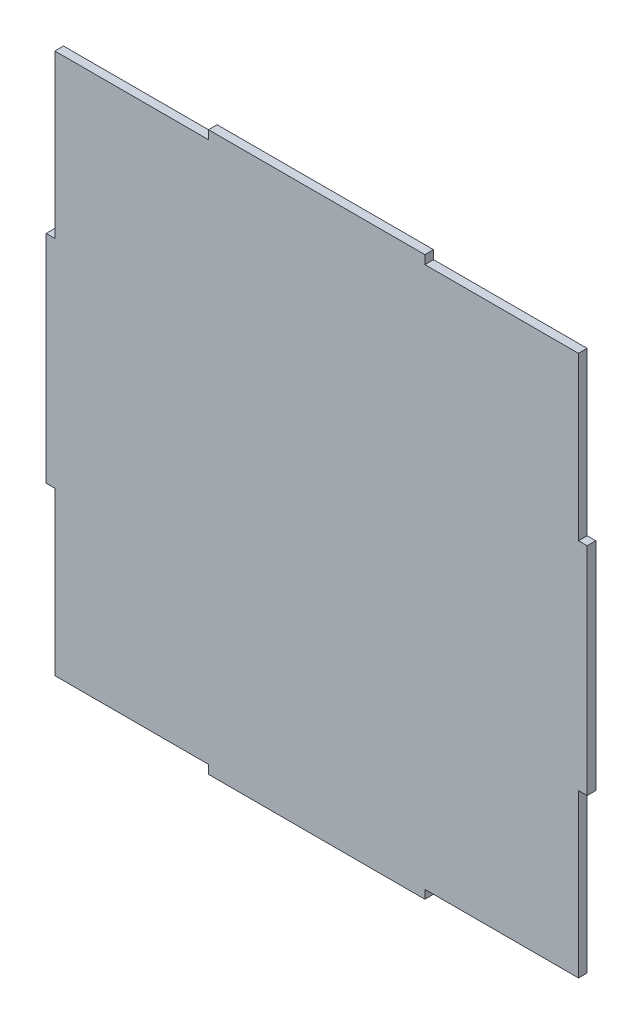
ISO-10303-21;
HEADER;
FILE_DESCRIPTION(('STEP AP214'),'2;1');
FILE_NAME('part.step','',(''),(''),'','','');
FILE_SCHEMA(('AUTOMOTIVE_DESIGN { 1 0 10303 214 1 1 1 1 }'));
ENDSEC;
DATA;
#1=APPLICATION_CONTEXT('core data for automotive mechanical design processes');
#2=APPLICATION_PROTOCOL_DEFINITION('international standard','automotive_design',2000,#1);
#3=PRODUCT_CONTEXT('',#1,'mechanical');
#4=PRODUCT('Part','Part','',(#3));
#5=PRODUCT_RELATED_PRODUCT_CATEGORY('part','',(#4));
#6=PRODUCT_DEFINITION_FORMATION('','',#4);
#7=PRODUCT_DEFINITION_CONTEXT('part definition',#1,'design');
#8=PRODUCT_DEFINITION('design','',#6,#7);
#9=PRODUCT_DEFINITION_SHAPE('','',#8);
#10=(LENGTH_UNIT() NAMED_UNIT(*) SI_UNIT(.MILLI.,.METRE.));
#11=(NAMED_UNIT(*) PLANE_ANGLE_UNIT() SI_UNIT($,.RADIAN.));
#12=(NAMED_UNIT(*) SI_UNIT($,.STERADIAN.) SOLID_ANGLE_UNIT());
#13=UNCERTAINTY_MEASURE_WITH_UNIT(LENGTH_MEASURE(1.E-05),#10,'distance_accuracy_value','');
#14=(GEOMETRIC_REPRESENTATION_CONTEXT(3) GLOBAL_UNCERTAINTY_ASSIGNED_CONTEXT((#13)) GLOBAL_UNIT_ASSIGNED_CONTEXT((#10,
#11,#12)) REPRESENTATION_CONTEXT('',''));
#15=CARTESIAN_POINT('',(0.,0.,0.));
#16=DIRECTION('',(0.,0.,1.));
#17=DIRECTION('',(1.,0.,0.));
#18=AXIS2_PLACEMENT_3D('',#15,#16,#17);
#19=CARTESIAN_POINT('',(50.,128.909239656093,4.));
#20=DIRECTION('',(0.,-1.,0.));
#21=DIRECTION('',(0.,0.,-1.));
#22=AXIS2_PLACEMENT_3D('',#19,#20,#21);
#23=PLANE('',#22);
#24=DIRECTION('',(-1.,0.,0.));
#25=VECTOR('',#24,1.);
#26=CARTESIAN_POINT('',(50.,128.909239656093,0.));
#27=LINE('',#26,#25);
#28=CARTESIAN_POINT('',(50.,128.909239656093,0.));
#29=VERTEX_POINT('',#28);
#30=CARTESIAN_POINT('',(-50.,128.909239656093,0.));
#31=VERTEX_POINT('',#30);
#32=EDGE_CURVE('E222',#29,#31,#27,.T.);
#33=ORIENTED_EDGE('',*,*,#32,.T.);
#34=DIRECTION('',(0.,0.,-1.));
#35=VECTOR('',#34,1.);
#36=CARTESIAN_POINT('',(-50.,128.909239656093,4.));
#37=LINE('',#36,#35);
#38=CARTESIAN_POINT('',(-50.,128.909239656093,4.));
#39=VERTEX_POINT('',#38);
#40=EDGE_CURVE('E11',#39,#31,#37,.T.);
#41=ORIENTED_EDGE('',*,*,#40,.F.);
#42=DIRECTION('',(-1.,0.,0.));
#43=VECTOR('',#42,1.);
#44=CARTESIAN_POINT('',(50.,128.909239656093,4.));
#45=LINE('',#44,#43);
#46=CARTESIAN_POINT('',(50.,128.909239656093,4.));
#47=VERTEX_POINT('',#46);
#48=EDGE_CURVE('E280',#47,#39,#45,.T.);
#49=ORIENTED_EDGE('',*,*,#48,.F.);
#50=DIRECTION('',(0.,0.,-1.));
#51=VECTOR('',#50,1.);
#52=CARTESIAN_POINT('',(50.,128.909239656093,4.));
#53=LINE('',#52,#51);
#54=EDGE_CURVE('E218',#47,#29,#53,.T.);
#55=ORIENTED_EDGE('',*,*,#54,.T.);
#56=EDGE_LOOP('',(#33,#41,#49,#55));
#57=FACE_BOUND('',#56,.T.);
#58=ADVANCED_FACE('F49',(#57),#23,.F.);
#59=CARTESIAN_POINT('',(-50.,128.909239656093,4.));
#60=DIRECTION('',(1.,0.,0.));
#61=DIRECTION('',(0.,0.,-1.));
#62=AXIS2_PLACEMENT_3D('',#59,#60,#61);
#63=PLANE('',#62);
#64=DIRECTION('',(0.,-1.,0.));
#65=VECTOR('',#64,1.);
#66=CARTESIAN_POINT('',(-50.,128.909239656093,0.));
#67=LINE('',#66,#65);
#68=CARTESIAN_POINT('',(-50.,124.909239656093,0.));
#69=VERTEX_POINT('',#68);
#70=EDGE_CURVE('E226',#31,#69,#67,.T.);
#71=ORIENTED_EDGE('',*,*,#70,.T.);
#72=DIRECTION('',(0.,0.,-1.));
#73=VECTOR('',#72,1.);
#74=CARTESIAN_POINT('',(-50.,124.909239656093,4.));
#75=LINE('',#74,#73);
#76=CARTESIAN_POINT('',(-50.,124.909239656093,4.));
#77=VERTEX_POINT('',#76);
#78=EDGE_CURVE('E58',#77,#69,#75,.T.);
#79=ORIENTED_EDGE('',*,*,#78,.F.);
#80=DIRECTION('',(0.,-1.,0.));
#81=VECTOR('',#80,1.);
#82=CARTESIAN_POINT('',(-50.,128.909239656093,4.));
#83=LINE('',#82,#81);
#84=EDGE_CURVE('E145',#39,#77,#83,.T.);
#85=ORIENTED_EDGE('',*,*,#84,.F.);
#86=ORIENTED_EDGE('',*,*,#40,.T.);
#87=EDGE_LOOP('',(#71,#79,#85,#86));
#88=FACE_BOUND('',#87,.T.);
#89=ADVANCED_FACE('F430',(#88),#63,.F.);
#90=CARTESIAN_POINT('',(-50.,124.909239656093,4.));
#91=DIRECTION('',(0.,-1.,0.));
#92=DIRECTION('',(0.,0.,-1.));
#93=AXIS2_PLACEMENT_3D('',#90,#91,#92);
#94=PLANE('',#93);
#95=DIRECTION('',(-1.,0.,0.));
#96=VECTOR('',#95,1.);
#97=CARTESIAN_POINT('',(-50.,124.909239656093,0.));
#98=LINE('',#97,#96);
#99=CARTESIAN_POINT('',(-121.,124.909239656093,0.));
#100=VERTEX_POINT('',#99);
#101=EDGE_CURVE('E229',#69,#100,#98,.T.);
#102=ORIENTED_EDGE('',*,*,#101,.T.);
#103=DIRECTION('',(0.,0.,-1.));
#104=VECTOR('',#103,1.);
#105=CARTESIAN_POINT('',(-121.,124.909239656093,4.));
#106=LINE('',#105,#104);
#107=CARTESIAN_POINT('',(-121.,124.909239656093,4.));
#108=VERTEX_POINT('',#107);
#109=EDGE_CURVE('E339',#108,#100,#106,.T.);
#110=ORIENTED_EDGE('',*,*,#109,.F.);
#111=DIRECTION('',(-1.,0.,0.));
#112=VECTOR('',#111,1.);
#113=CARTESIAN_POINT('',(-50.,124.909239656093,4.));
#114=LINE('',#113,#112);
#115=EDGE_CURVE('E349',#77,#108,#114,.T.);
#116=ORIENTED_EDGE('',*,*,#115,.F.);
#117=ORIENTED_EDGE('',*,*,#78,.T.);
#118=EDGE_LOOP('',(#102,#110,#116,#117));
#119=FACE_BOUND('',#118,.T.);
#120=ADVANCED_FACE('F347',(#119),#94,.F.);
#121=CARTESIAN_POINT('',(-121.,124.909239656093,4.));
#122=DIRECTION('',(1.,0.,0.));
#123=DIRECTION('',(0.,0.,-1.));
#124=AXIS2_PLACEMENT_3D('',#121,#122,#123);
#125=PLANE('',#124);
#126=DIRECTION('',(0.,-1.,0.));
#127=VECTOR('',#126,1.);
#128=CARTESIAN_POINT('',(-121.,124.909239656093,0.));
#129=LINE('',#128,#127);
#130=CARTESIAN_POINT('',(-121.,49.9092396560933,0.));
#131=VERTEX_POINT('',#130);
#132=EDGE_CURVE('E232',#100,#131,#129,.T.);
#133=ORIENTED_EDGE('',*,*,#132,.T.);
#134=DIRECTION('',(0.,0.,-1.));
#135=VECTOR('',#134,1.);
#136=CARTESIAN_POINT('',(-121.,49.9092396560933,4.));
#137=LINE('',#136,#135);
#138=CARTESIAN_POINT('',(-121.,49.9092396560933,4.));
#139=VERTEX_POINT('',#138);
#140=EDGE_CURVE('E335',#139,#131,#137,.T.);
#141=ORIENTED_EDGE('',*,*,#140,.F.);
#142=DIRECTION('',(0.,-1.,0.));
#143=VECTOR('',#142,1.);
#144=CARTESIAN_POINT('',(-121.,124.909239656093,4.));
#145=LINE('',#144,#143);
#146=EDGE_CURVE('E368',#108,#139,#145,.T.);
#147=ORIENTED_EDGE('',*,*,#146,.F.);
#148=ORIENTED_EDGE('',*,*,#109,.T.);
#149=EDGE_LOOP('',(#133,#141,#147,#148));
#150=FACE_BOUND('',#149,.T.);
#151=ADVANCED_FACE('F358',(#150),#125,.F.);
#152=CARTESIAN_POINT('',(-121.,49.9092396560933,4.));
#153=DIRECTION('',(0.,-1.,0.));
#154=DIRECTION('',(0.,0.,-1.));
#155=AXIS2_PLACEMENT_3D('',#152,#153,#154);
#156=PLANE('',#155);
#157=DIRECTION('',(-1.,0.,0.));
#158=VECTOR('',#157,1.);
#159=CARTESIAN_POINT('',(-121.,49.9092396560933,0.));
#160=LINE('',#159,#158);
#161=CARTESIAN_POINT('',(-125.,49.9092396560933,0.));
#162=VERTEX_POINT('',#161);
#163=EDGE_CURVE('E235',#131,#162,#160,.T.);
#164=ORIENTED_EDGE('',*,*,#163,.T.);
#165=DIRECTION('',(0.,0.,-1.));
#166=VECTOR('',#165,1.);
#167=CARTESIAN_POINT('',(-125.,49.9092396560933,4.));
#168=LINE('',#167,#166);
#169=CARTESIAN_POINT('',(-125.,49.9092396560933,4.));
#170=VERTEX_POINT('',#169);
#171=EDGE_CURVE('E331',#170,#162,#168,.T.);
#172=ORIENTED_EDGE('',*,*,#171,.F.);
#173=DIRECTION('',(-1.,0.,0.));
#174=VECTOR('',#173,1.);
#175=CARTESIAN_POINT('',(-121.,49.9092396560933,4.));
#176=LINE('',#175,#174);
#177=EDGE_CURVE('E364',#139,#170,#176,.T.);
#178=ORIENTED_EDGE('',*,*,#177,.F.);
#179=ORIENTED_EDGE('',*,*,#140,.T.);
#180=EDGE_LOOP('',(#164,#172,#178,#179));
#181=FACE_BOUND('',#180,.T.);
#182=ADVANCED_FACE('F362',(#181),#156,.F.);
#183=CARTESIAN_POINT('',(-125.,49.9092396560933,4.));
#184=DIRECTION('',(1.,0.,0.));
#185=DIRECTION('',(0.,0.,-1.));
#186=AXIS2_PLACEMENT_3D('',#183,#184,#185);
#187=PLANE('',#186);
#188=DIRECTION('',(0.,-1.,0.));
#189=VECTOR('',#188,1.);
#190=CARTESIAN_POINT('',(-125.,49.9092396560933,0.));
#191=LINE('',#190,#189);
#192=CARTESIAN_POINT('',(-125.,-50.0907603439067,0.));
#193=VERTEX_POINT('',#192);
#194=EDGE_CURVE('E238',#162,#193,#191,.T.);
#195=ORIENTED_EDGE('',*,*,#194,.T.);
#196=DIRECTION('',(0.,0.,-1.));
#197=VECTOR('',#196,1.);
#198=CARTESIAN_POINT('',(-125.,-50.0907603439067,4.));
#199=LINE('',#198,#197);
#200=CARTESIAN_POINT('',(-125.,-50.0907603439067,4.));
#201=VERTEX_POINT('',#200);
#202=EDGE_CURVE('E327',#201,#193,#199,.T.);
#203=ORIENTED_EDGE('',*,*,#202,.F.);
#204=DIRECTION('',(0.,-1.,0.));
#205=VECTOR('',#204,1.);
#206=CARTESIAN_POINT('',(-125.,49.9092396560933,4.));
#207=LINE('',#206,#205);
#208=EDGE_CURVE('E367',#170,#201,#207,.T.);
#209=ORIENTED_EDGE('',*,*,#208,.F.);
#210=ORIENTED_EDGE('',*,*,#171,.T.);
#211=EDGE_LOOP('',(#195,#203,#209,#210));
#212=FACE_BOUND('',#211,.T.);
#213=ADVANCED_FACE('F443',(#212),#187,.F.);
#214=CARTESIAN_POINT('',(-125.,-50.0907603439067,4.));
#215=DIRECTION('',(0.,1.,0.));
#216=DIRECTION('',(0.,0.,1.));
#217=AXIS2_PLACEMENT_3D('',#214,#215,#216);
#218=PLANE('',#217);
#219=DIRECTION('',(1.,0.,0.));
#220=VECTOR('',#219,1.);
#221=CARTESIAN_POINT('',(-125.,-50.0907603439067,0.));
#222=LINE('',#221,#220);
#223=CARTESIAN_POINT('',(-121.,-50.0907603439067,0.));
#224=VERTEX_POINT('',#223);
#225=EDGE_CURVE('E241',#193,#224,#222,.T.);
#226=ORIENTED_EDGE('',*,*,#225,.T.);
#227=DIRECTION('',(0.,0.,-1.));
#228=VECTOR('',#227,1.);
#229=CARTESIAN_POINT('',(-121.,-50.0907603439067,4.));
#230=LINE('',#229,#228);
#231=CARTESIAN_POINT('',(-121.,-50.0907603439067,4.));
#232=VERTEX_POINT('',#231);
#233=EDGE_CURVE('E323',#232,#224,#230,.T.);
#234=ORIENTED_EDGE('',*,*,#233,.F.);
#235=DIRECTION('',(1.,0.,0.));
#236=VECTOR('',#235,1.);
#237=CARTESIAN_POINT('',(-125.,-50.0907603439067,4.));
#238=LINE('',#237,#236);
#239=EDGE_CURVE('E372',#201,#232,#238,.T.);
#240=ORIENTED_EDGE('',*,*,#239,.F.);
#241=ORIENTED_EDGE('',*,*,#202,.T.);
#242=EDGE_LOOP('',(#226,#234,#240,#241));
#243=FACE_BOUND('',#242,.T.);
#244=ADVANCED_FACE('F446',(#243),#218,.F.);
#245=CARTESIAN_POINT('',(-121.,-50.0907603439067,4.));
#246=DIRECTION('',(1.,0.,0.));
#247=DIRECTION('',(0.,0.,-1.));
#248=AXIS2_PLACEMENT_3D('',#245,#246,#247);
#249=PLANE('',#248);
#250=DIRECTION('',(0.,-1.,0.));
#251=VECTOR('',#250,1.);
#252=CARTESIAN_POINT('',(-121.,-50.0907603439067,0.));
#253=LINE('',#252,#251);
#254=CARTESIAN_POINT('',(-121.,-125.090760343907,0.));
#255=VERTEX_POINT('',#254);
#256=EDGE_CURVE('E244',#224,#255,#253,.T.);
#257=ORIENTED_EDGE('',*,*,#256,.T.);
#258=DIRECTION('',(0.,0.,-1.));
#259=VECTOR('',#258,1.);
#260=CARTESIAN_POINT('',(-121.,-125.090760343907,4.));
#261=LINE('',#260,#259);
#262=CARTESIAN_POINT('',(-121.,-125.090760343907,4.));
#263=VERTEX_POINT('',#262);
#264=EDGE_CURVE('E319',#263,#255,#261,.T.);
#265=ORIENTED_EDGE('',*,*,#264,.F.);
#266=DIRECTION('',(0.,-1.,0.));
#267=VECTOR('',#266,1.);
#268=CARTESIAN_POINT('',(-121.,-50.0907603439067,4.));
#269=LINE('',#268,#267);
#270=EDGE_CURVE('E379',#232,#263,#269,.T.);
#271=ORIENTED_EDGE('',*,*,#270,.F.);
#272=ORIENTED_EDGE('',*,*,#233,.T.);
#273=EDGE_LOOP('',(#257,#265,#271,#272));
#274=FACE_BOUND('',#273,.T.);
#275=ADVANCED_FACE('F450',(#274),#249,.F.);
#276=CARTESIAN_POINT('',(-121.,-125.090760343907,4.));
#277=DIRECTION('',(0.,1.,0.));
#278=DIRECTION('',(0.,0.,1.));
#279=AXIS2_PLACEMENT_3D('',#276,#277,#278);
#280=PLANE('',#279);
#281=DIRECTION('',(1.,0.,0.));
#282=VECTOR('',#281,1.);
#283=CARTESIAN_POINT('',(-121.,-125.090760343907,0.));
#284=LINE('',#283,#282);
#285=CARTESIAN_POINT('',(-50.,-125.090760343907,0.));
#286=VERTEX_POINT('',#285);
#287=EDGE_CURVE('E247',#255,#286,#284,.T.);
#288=ORIENTED_EDGE('',*,*,#287,.T.);
#289=DIRECTION('',(0.,0.,-1.));
#290=VECTOR('',#289,1.);
#291=CARTESIAN_POINT('',(-50.,-125.090760343907,4.));
#292=LINE('',#291,#290);
#293=CARTESIAN_POINT('',(-50.,-125.090760343907,4.));
#294=VERTEX_POINT('',#293);
#295=EDGE_CURVE('E315',#294,#286,#292,.T.);
#296=ORIENTED_EDGE('',*,*,#295,.F.);
#297=DIRECTION('',(1.,0.,0.));
#298=VECTOR('',#297,1.);
#299=CARTESIAN_POINT('',(-121.,-125.090760343907,4.));
#300=LINE('',#299,#298);
#301=EDGE_CURVE('E382',#263,#294,#300,.T.);
#302=ORIENTED_EDGE('',*,*,#301,.F.);
#303=ORIENTED_EDGE('',*,*,#264,.T.);
#304=EDGE_LOOP('',(#288,#296,#302,#303));
#305=FACE_BOUND('',#304,.T.);
#306=ADVANCED_FACE('F454',(#305),#280,.F.);
#307=CARTESIAN_POINT('',(-50.,-125.090760343907,4.));
#308=DIRECTION('',(1.,0.,0.));
#309=DIRECTION('',(0.,0.,-1.));
#310=AXIS2_PLACEMENT_3D('',#307,#308,#309);
#311=PLANE('',#310);
#312=DIRECTION('',(0.,-1.,0.));
#313=VECTOR('',#312,1.);
#314=CARTESIAN_POINT('',(-50.,-125.090760343907,0.));
#315=LINE('',#314,#313);
#316=CARTESIAN_POINT('',(-50.,-129.090760343907,0.));
#317=VERTEX_POINT('',#316);
#318=EDGE_CURVE('E250',#286,#317,#315,.T.);
#319=ORIENTED_EDGE('',*,*,#318,.T.);
#320=DIRECTION('',(0.,0.,-1.));
#321=VECTOR('',#320,1.);
#322=CARTESIAN_POINT('',(-50.,-129.090760343907,4.));
#323=LINE('',#322,#321);
#324=CARTESIAN_POINT('',(-50.,-129.090760343907,4.));
#325=VERTEX_POINT('',#324);
#326=EDGE_CURVE('E311',#325,#317,#323,.T.);
#327=ORIENTED_EDGE('',*,*,#326,.F.);
#328=DIRECTION('',(0.,-1.,0.));
#329=VECTOR('',#328,1.);
#330=CARTESIAN_POINT('',(-50.,-125.090760343907,4.));
#331=LINE('',#330,#329);
#332=EDGE_CURVE('E385',#294,#325,#331,.T.);
#333=ORIENTED_EDGE('',*,*,#332,.F.);
#334=ORIENTED_EDGE('',*,*,#295,.T.);
#335=EDGE_LOOP('',(#319,#327,#333,#334));
#336=FACE_BOUND('',#335,.T.);
#337=ADVANCED_FACE('F458',(#336),#311,.F.);
#338=CARTESIAN_POINT('',(-50.,-129.090760343907,4.));
#339=DIRECTION('',(0.,1.,0.));
#340=DIRECTION('',(0.,0.,1.));
#341=AXIS2_PLACEMENT_3D('',#338,#339,#340);
#342=PLANE('',#341);
#343=DIRECTION('',(1.,0.,0.));
#344=VECTOR('',#343,1.);
#345=CARTESIAN_POINT('',(-50.,-129.090760343907,0.));
#346=LINE('',#345,#344);
#347=CARTESIAN_POINT('',(50.,-129.090760343907,0.));
#348=VERTEX_POINT('',#347);
#349=EDGE_CURVE('E253',#317,#348,#346,.T.);
#350=ORIENTED_EDGE('',*,*,#349,.T.);
#351=DIRECTION('',(0.,0.,-1.));
#352=VECTOR('',#351,1.);
#353=CARTESIAN_POINT('',(50.,-129.090760343907,4.));
#354=LINE('',#353,#352);
#355=CARTESIAN_POINT('',(50.,-129.090760343907,4.));
#356=VERTEX_POINT('',#355);
#357=EDGE_CURVE('E307',#356,#348,#354,.T.);
#358=ORIENTED_EDGE('',*,*,#357,.F.);
#359=DIRECTION('',(1.,0.,0.));
#360=VECTOR('',#359,1.);
#361=CARTESIAN_POINT('',(-50.,-129.090760343907,4.));
#362=LINE('',#361,#360);
#363=EDGE_CURVE('E388',#325,#356,#362,.T.);
#364=ORIENTED_EDGE('',*,*,#363,.F.);
#365=ORIENTED_EDGE('',*,*,#326,.T.);
#366=EDGE_LOOP('',(#350,#358,#364,#365));
#367=FACE_BOUND('',#366,.T.);
#368=ADVANCED_FACE('F462',(#367),#342,.F.);
#369=CARTESIAN_POINT('',(50.,-129.090760343907,4.));
#370=DIRECTION('',(-1.,0.,0.));
#371=DIRECTION('',(0.,0.,1.));
#372=AXIS2_PLACEMENT_3D('',#369,#370,#371);
#373=PLANE('',#372);
#374=DIRECTION('',(0.,1.,0.));
#375=VECTOR('',#374,1.);
#376=CARTESIAN_POINT('',(50.,-129.090760343907,0.));
#377=LINE('',#376,#375);
#378=CARTESIAN_POINT('',(50.,-125.090760343907,0.));
#379=VERTEX_POINT('',#378);
#380=EDGE_CURVE('E256',#348,#379,#377,.T.);
#381=ORIENTED_EDGE('',*,*,#380,.T.);
#382=DIRECTION('',(0.,0.,-1.));
#383=VECTOR('',#382,1.);
#384=CARTESIAN_POINT('',(50.,-125.090760343907,4.));
#385=LINE('',#384,#383);
#386=CARTESIAN_POINT('',(50.,-125.090760343907,4.));
#387=VERTEX_POINT('',#386);
#388=EDGE_CURVE('E303',#387,#379,#385,.T.);
#389=ORIENTED_EDGE('',*,*,#388,.F.);
#390=DIRECTION('',(0.,1.,0.));
#391=VECTOR('',#390,1.);
#392=CARTESIAN_POINT('',(50.,-129.090760343907,4.));
#393=LINE('',#392,#391);
#394=EDGE_CURVE('E391',#356,#387,#393,.T.);
#395=ORIENTED_EDGE('',*,*,#394,.F.);
#396=ORIENTED_EDGE('',*,*,#357,.T.);
#397=EDGE_LOOP('',(#381,#389,#395,#396));
#398=FACE_BOUND('',#397,.T.);
#399=ADVANCED_FACE('F466',(#398),#373,.F.);
#400=CARTESIAN_POINT('',(50.,-125.090760343907,4.));
#401=DIRECTION('',(0.,1.,0.));
#402=DIRECTION('',(0.,0.,1.));
#403=AXIS2_PLACEMENT_3D('',#400,#401,#402);
#404=PLANE('',#403);
#405=DIRECTION('',(1.,0.,0.));
#406=VECTOR('',#405,1.);
#407=CARTESIAN_POINT('',(50.,-125.090760343907,0.));
#408=LINE('',#407,#406);
#409=CARTESIAN_POINT('',(121.,-125.090760343907,0.));
#410=VERTEX_POINT('',#409);
#411=EDGE_CURVE('E259',#379,#410,#408,.T.);
#412=ORIENTED_EDGE('',*,*,#411,.T.);
#413=DIRECTION('',(0.,0.,-1.));
#414=VECTOR('',#413,1.);
#415=CARTESIAN_POINT('',(121.,-125.090760343907,4.));
#416=LINE('',#415,#414);
#417=CARTESIAN_POINT('',(121.,-125.090760343907,4.));
#418=VERTEX_POINT('',#417);
#419=EDGE_CURVE('E299',#418,#410,#416,.T.);
#420=ORIENTED_EDGE('',*,*,#419,.F.);
#421=DIRECTION('',(1.,0.,0.));
#422=VECTOR('',#421,1.);
#423=CARTESIAN_POINT('',(50.,-125.090760343907,4.));
#424=LINE('',#423,#422);
#425=EDGE_CURVE('E394',#387,#418,#424,.T.);
#426=ORIENTED_EDGE('',*,*,#425,.F.);
#427=ORIENTED_EDGE('',*,*,#388,.T.);
#428=EDGE_LOOP('',(#412,#420,#426,#427));
#429=FACE_BOUND('',#428,.T.);
#430=ADVANCED_FACE('F470',(#429),#404,.F.);
#431=CARTESIAN_POINT('',(121.,-125.090760343907,4.));
#432=DIRECTION('',(-1.,0.,0.));
#433=DIRECTION('',(0.,0.,1.));
#434=AXIS2_PLACEMENT_3D('',#431,#432,#433);
#435=PLANE('',#434);
#436=DIRECTION('',(0.,1.,0.));
#437=VECTOR('',#436,1.);
#438=CARTESIAN_POINT('',(121.,-125.090760343907,0.));
#439=LINE('',#438,#437);
#440=CARTESIAN_POINT('',(121.,-50.0907603439067,0.));
#441=VERTEX_POINT('',#440);
#442=EDGE_CURVE('E262',#410,#441,#439,.T.);
#443=ORIENTED_EDGE('',*,*,#442,.T.);
#444=DIRECTION('',(0.,0.,-1.));
#445=VECTOR('',#444,1.);
#446=CARTESIAN_POINT('',(121.,-50.0907603439067,4.));
#447=LINE('',#446,#445);
#448=CARTESIAN_POINT('',(121.,-50.0907603439067,4.));
#449=VERTEX_POINT('',#448);
#450=EDGE_CURVE('E295',#449,#441,#447,.T.);
#451=ORIENTED_EDGE('',*,*,#450,.F.);
#452=DIRECTION('',(0.,1.,0.));
#453=VECTOR('',#452,1.);
#454=CARTESIAN_POINT('',(121.,-125.090760343907,4.));
#455=LINE('',#454,#453);
#456=EDGE_CURVE('E397',#418,#449,#455,.T.);
#457=ORIENTED_EDGE('',*,*,#456,.F.);
#458=ORIENTED_EDGE('',*,*,#419,.T.);
#459=EDGE_LOOP('',(#443,#451,#457,#458));
#460=FACE_BOUND('',#459,.T.);
#461=ADVANCED_FACE('F474',(#460),#435,.F.);
#462=CARTESIAN_POINT('',(121.,-50.0907603439067,4.));
#463=DIRECTION('',(0.,1.,0.));
#464=DIRECTION('',(0.,0.,1.));
#465=AXIS2_PLACEMENT_3D('',#462,#463,#464);
#466=PLANE('',#465);
#467=DIRECTION('',(1.,0.,0.));
#468=VECTOR('',#467,1.);
#469=CARTESIAN_POINT('',(121.,-50.0907603439067,0.));
#470=LINE('',#469,#468);
#471=CARTESIAN_POINT('',(125.,-50.0907603439067,0.));
#472=VERTEX_POINT('',#471);
#473=EDGE_CURVE('E265',#441,#472,#470,.T.);
#474=ORIENTED_EDGE('',*,*,#473,.T.);
#475=DIRECTION('',(0.,0.,-1.));
#476=VECTOR('',#475,1.);
#477=CARTESIAN_POINT('',(125.,-50.0907603439067,4.));
#478=LINE('',#477,#476);
#479=CARTESIAN_POINT('',(125.,-50.0907603439067,4.));
#480=VERTEX_POINT('',#479);
#481=EDGE_CURVE('E291',#480,#472,#478,.T.);
#482=ORIENTED_EDGE('',*,*,#481,.F.);
#483=DIRECTION('',(1.,0.,0.));
#484=VECTOR('',#483,1.);
#485=CARTESIAN_POINT('',(121.,-50.0907603439067,4.));
#486=LINE('',#485,#484);
#487=EDGE_CURVE('E400',#449,#480,#486,.T.);
#488=ORIENTED_EDGE('',*,*,#487,.F.);
#489=ORIENTED_EDGE('',*,*,#450,.T.);
#490=EDGE_LOOP('',(#474,#482,#488,#489));
#491=FACE_BOUND('',#490,.T.);
#492=ADVANCED_FACE('F478',(#491),#466,.F.);
#493=CARTESIAN_POINT('',(125.,-50.0907603439067,4.));
#494=DIRECTION('',(-1.,0.,0.));
#495=DIRECTION('',(0.,0.,1.));
#496=AXIS2_PLACEMENT_3D('',#493,#494,#495);
#497=PLANE('',#496);
#498=DIRECTION('',(0.,1.,0.));
#499=VECTOR('',#498,1.);
#500=CARTESIAN_POINT('',(125.,-50.0907603439067,0.));
#501=LINE('',#500,#499);
#502=CARTESIAN_POINT('',(125.,49.9092396560933,0.));
#503=VERTEX_POINT('',#502);
#504=EDGE_CURVE('E268',#472,#503,#501,.T.);
#505=ORIENTED_EDGE('',*,*,#504,.T.);
#506=DIRECTION('',(0.,0.,-1.));
#507=VECTOR('',#506,1.);
#508=CARTESIAN_POINT('',(125.,49.9092396560933,4.));
#509=LINE('',#508,#507);
#510=CARTESIAN_POINT('',(125.,49.9092396560933,4.));
#511=VERTEX_POINT('',#510);
#512=EDGE_CURVE('E287',#511,#503,#509,.T.);
#513=ORIENTED_EDGE('',*,*,#512,.F.);
#514=DIRECTION('',(0.,1.,0.));
#515=VECTOR('',#514,1.);
#516=CARTESIAN_POINT('',(125.,-50.0907603439067,4.));
#517=LINE('',#516,#515);
#518=EDGE_CURVE('E403',#480,#511,#517,.T.);
#519=ORIENTED_EDGE('',*,*,#518,.F.);
#520=ORIENTED_EDGE('',*,*,#481,.T.);
#521=EDGE_LOOP('',(#505,#513,#519,#520));
#522=FACE_BOUND('',#521,.T.);
#523=ADVANCED_FACE('F411',(#522),#497,.F.);
#524=CARTESIAN_POINT('',(125.,49.9092396560933,4.));
#525=DIRECTION('',(0.,-1.,0.));
#526=DIRECTION('',(0.,0.,-1.));
#527=AXIS2_PLACEMENT_3D('',#524,#525,#526);
#528=PLANE('',#527);
#529=DIRECTION('',(-1.,0.,0.));
#530=VECTOR('',#529,1.);
#531=CARTESIAN_POINT('',(125.,49.9092396560933,0.));
#532=LINE('',#531,#530);
#533=CARTESIAN_POINT('',(121.,49.9092396560933,0.));
#534=VERTEX_POINT('',#533);
#535=EDGE_CURVE('E271',#503,#534,#532,.T.);
#536=ORIENTED_EDGE('',*,*,#535,.T.);
#537=DIRECTION('',(0.,0.,-1.));
#538=VECTOR('',#537,1.);
#539=CARTESIAN_POINT('',(121.,49.9092396560933,4.));
#540=LINE('',#539,#538);
#541=CARTESIAN_POINT('',(121.,49.9092396560933,4.));
#542=VERTEX_POINT('',#541);
#543=EDGE_CURVE('E211',#542,#534,#540,.T.);
#544=ORIENTED_EDGE('',*,*,#543,.F.);
#545=DIRECTION('',(-1.,0.,0.));
#546=VECTOR('',#545,1.);
#547=CARTESIAN_POINT('',(125.,49.9092396560933,4.));
#548=LINE('',#547,#546);
#549=EDGE_CURVE('E200',#511,#542,#548,.T.);
#550=ORIENTED_EDGE('',*,*,#549,.F.);
#551=ORIENTED_EDGE('',*,*,#512,.T.);
#552=EDGE_LOOP('',(#536,#544,#550,#551));
#553=FACE_BOUND('',#552,.T.);
#554=ADVANCED_FACE('F415',(#553),#528,.F.);
#555=CARTESIAN_POINT('',(121.,49.9092396560933,4.));
#556=DIRECTION('',(-1.,0.,0.));
#557=DIRECTION('',(0.,0.,1.));
#558=AXIS2_PLACEMENT_3D('',#555,#556,#557);
#559=PLANE('',#558);
#560=DIRECTION('',(0.,1.,0.));
#561=VECTOR('',#560,1.);
#562=CARTESIAN_POINT('',(121.,49.9092396560933,0.));
#563=LINE('',#562,#561);
#564=CARTESIAN_POINT('',(121.,124.909239656093,0.));
#565=VERTEX_POINT('',#564);
#566=EDGE_CURVE('E209',#534,#565,#563,.T.);
#567=ORIENTED_EDGE('',*,*,#566,.T.);
#568=DIRECTION('',(0.,0.,-1.));
#569=VECTOR('',#568,1.);
#570=CARTESIAN_POINT('',(121.,124.909239656093,4.));
#571=LINE('',#570,#569);
#572=CARTESIAN_POINT('',(121.,124.909239656093,4.));
#573=VERTEX_POINT('',#572);
#574=EDGE_CURVE('E206',#573,#565,#571,.T.);
#575=ORIENTED_EDGE('',*,*,#574,.F.);
#576=DIRECTION('',(0.,1.,0.));
#577=VECTOR('',#576,1.);
#578=CARTESIAN_POINT('',(121.,49.9092396560933,4.));
#579=LINE('',#578,#577);
#580=EDGE_CURVE('E194',#542,#573,#579,.T.);
#581=ORIENTED_EDGE('',*,*,#580,.F.);
#582=ORIENTED_EDGE('',*,*,#543,.T.);
#583=EDGE_LOOP('',(#567,#575,#581,#582));
#584=FACE_BOUND('',#583,.T.);
#585=ADVANCED_FACE('F207',(#584),#559,.F.);
#586=CARTESIAN_POINT('',(121.,124.909239656093,4.));
#587=DIRECTION('',(0.,-1.,0.));
#588=DIRECTION('',(0.,0.,-1.));
#589=AXIS2_PLACEMENT_3D('',#586,#587,#588);
#590=PLANE('',#589);
#591=DIRECTION('',(-1.,0.,0.));
#592=VECTOR('',#591,1.);
#593=CARTESIAN_POINT('',(121.,124.909239656093,0.));
#594=LINE('',#593,#592);
#595=CARTESIAN_POINT('',(50.,124.909239656093,0.));
#596=VERTEX_POINT('',#595);
#597=EDGE_CURVE('E131',#565,#596,#594,.T.);
#598=ORIENTED_EDGE('',*,*,#597,.T.);
#599=DIRECTION('',(0.,0.,-1.));
#600=VECTOR('',#599,1.);
#601=CARTESIAN_POINT('',(50.,124.909239656093,4.));
#602=LINE('',#601,#600);
#603=CARTESIAN_POINT('',(50.,124.909239656093,4.));
#604=VERTEX_POINT('',#603);
#605=EDGE_CURVE('E212',#604,#596,#602,.T.);
#606=ORIENTED_EDGE('',*,*,#605,.F.);
#607=DIRECTION('',(-1.,0.,0.));
#608=VECTOR('',#607,1.);
#609=CARTESIAN_POINT('',(121.,124.909239656093,4.));
#610=LINE('',#609,#608);
#611=EDGE_CURVE('E198',#573,#604,#610,.T.);
#612=ORIENTED_EDGE('',*,*,#611,.F.);
#613=ORIENTED_EDGE('',*,*,#574,.T.);
#614=EDGE_LOOP('',(#598,#606,#612,#613));
#615=FACE_BOUND('',#614,.T.);
#616=ADVANCED_FACE('F214',(#615),#590,.F.);
#617=CARTESIAN_POINT('',(50.,124.909239656093,4.));
#618=DIRECTION('',(-1.,0.,0.));
#619=DIRECTION('',(0.,0.,1.));
#620=AXIS2_PLACEMENT_3D('',#617,#618,#619);
#621=PLANE('',#620);
#622=DIRECTION('',(0.,1.,0.));
#623=VECTOR('',#622,1.);
#624=CARTESIAN_POINT('',(50.,124.909239656093,0.));
#625=LINE('',#624,#623);
#626=EDGE_CURVE('E137',#596,#29,#625,.T.);
#627=ORIENTED_EDGE('',*,*,#626,.T.);
#628=ORIENTED_EDGE('',*,*,#54,.F.);
#629=DIRECTION('',(0.,1.,0.));
#630=VECTOR('',#629,1.);
#631=CARTESIAN_POINT('',(50.,124.909239656093,4.));
#632=LINE('',#631,#630);
#633=EDGE_CURVE('E66',#604,#47,#632,.T.);
#634=ORIENTED_EDGE('',*,*,#633,.F.);
#635=ORIENTED_EDGE('',*,*,#605,.T.);
#636=EDGE_LOOP('',(#627,#628,#634,#635));
#637=FACE_BOUND('',#636,.T.);
#638=ADVANCED_FACE('F419',(#637),#621,.F.);
#639=CARTESIAN_POINT('',(0.,0.,4.));
#640=DIRECTION('',(0.,0.,1.));
#641=DIRECTION('',(1.,0.,0.));
#642=AXIS2_PLACEMENT_3D('',#639,#640,#641);
#643=PLANE('',#642);
#644=ORIENTED_EDGE('',*,*,#48,.T.);
#645=ORIENTED_EDGE('',*,*,#84,.T.);
#646=ORIENTED_EDGE('',*,*,#115,.T.);
#647=ORIENTED_EDGE('',*,*,#146,.T.);
#648=ORIENTED_EDGE('',*,*,#177,.T.);
#649=ORIENTED_EDGE('',*,*,#208,.T.);
#650=ORIENTED_EDGE('',*,*,#239,.T.);
#651=ORIENTED_EDGE('',*,*,#270,.T.);
#652=ORIENTED_EDGE('',*,*,#301,.T.);
#653=ORIENTED_EDGE('',*,*,#332,.T.);
#654=ORIENTED_EDGE('',*,*,#363,.T.);
#655=ORIENTED_EDGE('',*,*,#394,.T.);
#656=ORIENTED_EDGE('',*,*,#425,.T.);
#657=ORIENTED_EDGE('',*,*,#456,.T.);
#658=ORIENTED_EDGE('',*,*,#487,.T.);
#659=ORIENTED_EDGE('',*,*,#518,.T.);
#660=ORIENTED_EDGE('',*,*,#549,.T.);
#661=ORIENTED_EDGE('',*,*,#580,.T.);
#662=ORIENTED_EDGE('',*,*,#611,.T.);
#663=ORIENTED_EDGE('',*,*,#633,.T.);
#664=EDGE_LOOP('',(#644,#645,#646,#647,#648,#649,#650,#651,#652,#653,#654,#655,#656,#657,#658,
#659,#660,#661,#662,#663));
#665=FACE_BOUND('',#664,.T.);
#666=ADVANCED_FACE('F196',(#665),#643,.T.);
#667=CARTESIAN_POINT('',(0.,0.,0.));
#668=DIRECTION('',(0.,0.,1.));
#669=DIRECTION('',(1.,0.,0.));
#670=AXIS2_PLACEMENT_3D('',#667,#668,#669);
#671=PLANE('',#670);
#672=ORIENTED_EDGE('',*,*,#32,.F.);
#673=ORIENTED_EDGE('',*,*,#626,.F.);
#674=ORIENTED_EDGE('',*,*,#597,.F.);
#675=ORIENTED_EDGE('',*,*,#566,.F.);
#676=ORIENTED_EDGE('',*,*,#535,.F.);
#677=ORIENTED_EDGE('',*,*,#504,.F.);
#678=ORIENTED_EDGE('',*,*,#473,.F.);
#679=ORIENTED_EDGE('',*,*,#442,.F.);
#680=ORIENTED_EDGE('',*,*,#411,.F.);
#681=ORIENTED_EDGE('',*,*,#380,.F.);
#682=ORIENTED_EDGE('',*,*,#349,.F.);
#683=ORIENTED_EDGE('',*,*,#318,.F.);
#684=ORIENTED_EDGE('',*,*,#287,.F.);
#685=ORIENTED_EDGE('',*,*,#256,.F.);
#686=ORIENTED_EDGE('',*,*,#225,.F.);
#687=ORIENTED_EDGE('',*,*,#194,.F.);
#688=ORIENTED_EDGE('',*,*,#163,.F.);
#689=ORIENTED_EDGE('',*,*,#132,.F.);
#690=ORIENTED_EDGE('',*,*,#101,.F.);
#691=ORIENTED_EDGE('',*,*,#70,.F.);
#692=EDGE_LOOP('',(#672,#673,#674,#675,#676,#677,#678,#679,#680,#681,#682,#683,#684,#685,#686,
#687,#688,#689,#690,#691));
#693=FACE_BOUND('',#692,.T.);
#694=ADVANCED_FACE('F353',(#693),#671,.F.);
#695=CLOSED_SHELL('',(#58,#89,#120,#151,#182,#213,#244,#275,#306,#337,#368,#399,#430,#461,#492,
#523,#554,#585,#616,#638,#666,#694));
#696=MANIFOLD_SOLID_BREP('B2',#695);
#697=ADVANCED_BREP_SHAPE_REPRESENTATION('',(#18,#696),#14);
#698=SHAPE_DEFINITION_REPRESENTATION(#9,#697);
ENDSEC;
END-ISO-10303-21;
